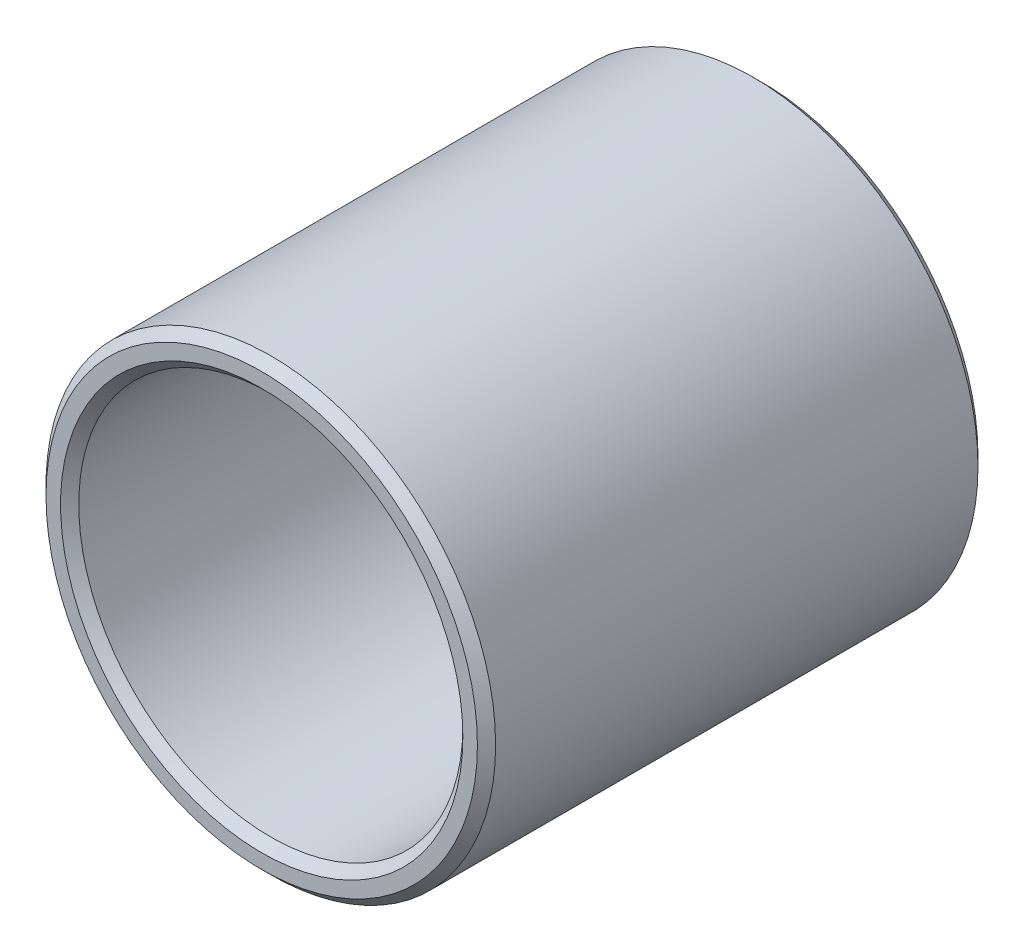
ISO-10303-21;
HEADER;
FILE_DESCRIPTION(('STEP AP214'),'2;1');
FILE_NAME('part.step','',(''),(''),'','','');
FILE_SCHEMA(('AUTOMOTIVE_DESIGN { 1 0 10303 214 1 1 1 1 }'));
ENDSEC;
DATA;
#1=APPLICATION_CONTEXT('core data for automotive mechanical design processes');
#2=APPLICATION_PROTOCOL_DEFINITION('international standard','automotive_design',2000,#1);
#3=PRODUCT_CONTEXT('',#1,'mechanical');
#4=PRODUCT('Part','Part','',(#3));
#5=PRODUCT_RELATED_PRODUCT_CATEGORY('part','',(#4));
#6=PRODUCT_DEFINITION_FORMATION('','',#4);
#7=PRODUCT_DEFINITION_CONTEXT('part definition',#1,'design');
#8=PRODUCT_DEFINITION('design','',#6,#7);
#9=PRODUCT_DEFINITION_SHAPE('','',#8);
#10=(LENGTH_UNIT() NAMED_UNIT(*) SI_UNIT(.MILLI.,.METRE.));
#11=(NAMED_UNIT(*) PLANE_ANGLE_UNIT() SI_UNIT($,.RADIAN.));
#12=(NAMED_UNIT(*) SI_UNIT($,.STERADIAN.) SOLID_ANGLE_UNIT());
#13=UNCERTAINTY_MEASURE_WITH_UNIT(LENGTH_MEASURE(1.E-05),#10,'distance_accuracy_value','');
#14=(GEOMETRIC_REPRESENTATION_CONTEXT(3) GLOBAL_UNCERTAINTY_ASSIGNED_CONTEXT((#13)) GLOBAL_UNIT_ASSIGNED_CONTEXT((#10,
#11,#12)) REPRESENTATION_CONTEXT('',''));
#15=CARTESIAN_POINT('',(0.,0.,0.));
#16=DIRECTION('',(0.,0.,1.));
#17=DIRECTION('',(1.,0.,0.));
#18=AXIS2_PLACEMENT_3D('',#15,#16,#17);
#19=CARTESIAN_POINT('',(0.,0.,13.75));
#20=DIRECTION('',(0.,0.,1.));
#21=DIRECTION('',(1.,0.,0.));
#22=AXIS2_PLACEMENT_3D('',#19,#20,#21);
#23=PLANE('',#22);
#24=CARTESIAN_POINT('',(0.,0.,13.75));
#25=DIRECTION('',(0.,0.,1.));
#26=DIRECTION('',(1.,0.,0.));
#27=AXIS2_PLACEMENT_3D('',#24,#25,#26);
#28=CIRCLE('',#27,11.85);
#29=CARTESIAN_POINT('',(11.85,0.,13.75));
#30=VERTEX_POINT('',#29);
#31=EDGE_CURVE('E45',#30,#30,#28,.T.);
#32=ORIENTED_EDGE('',*,*,#31,.T.);
#33=EDGE_LOOP('',(#32));
#34=FACE_BOUND('',#33,.T.);
#35=CARTESIAN_POINT('',(0.,0.,13.75));
#36=DIRECTION('',(0.,0.,1.));
#37=DIRECTION('',(1.,0.,0.));
#38=AXIS2_PLACEMENT_3D('',#35,#36,#37);
#39=CIRCLE('',#38,11.05);
#40=CARTESIAN_POINT('',(11.05,0.,13.75));
#41=VERTEX_POINT('',#40);
#42=EDGE_CURVE('E49',#41,#41,#39,.F.);
#43=ORIENTED_EDGE('',*,*,#42,.T.);
#44=EDGE_LOOP('',(#43));
#45=FACE_BOUND('',#44,.T.);
#46=ADVANCED_FACE('F34',(#34,#45),#23,.T.);
#47=CARTESIAN_POINT('',(0.,0.,-13.75));
#48=DIRECTION('',(0.,0.,1.));
#49=DIRECTION('',(1.,0.,0.));
#50=AXIS2_PLACEMENT_3D('',#47,#48,#49);
#51=PLANE('',#50);
#52=CARTESIAN_POINT('',(0.,0.,-13.75));
#53=DIRECTION('',(0.,0.,1.));
#54=DIRECTION('',(1.,0.,0.));
#55=AXIS2_PLACEMENT_3D('',#52,#53,#54);
#56=CIRCLE('',#55,11.85);
#57=CARTESIAN_POINT('',(11.85,0.,-13.75));
#58=VERTEX_POINT('',#57);
#59=EDGE_CURVE('E54',#58,#58,#56,.F.);
#60=ORIENTED_EDGE('',*,*,#59,.T.);
#61=EDGE_LOOP('',(#60));
#62=FACE_BOUND('',#61,.T.);
#63=CARTESIAN_POINT('',(0.,0.,-13.75));
#64=DIRECTION('',(0.,0.,1.));
#65=DIRECTION('',(1.,0.,0.));
#66=AXIS2_PLACEMENT_3D('',#63,#64,#65);
#67=CIRCLE('',#66,11.05);
#68=CARTESIAN_POINT('',(11.05,0.,-13.75));
#69=VERTEX_POINT('',#68);
#70=EDGE_CURVE('E57',#69,#69,#67,.T.);
#71=ORIENTED_EDGE('',*,*,#70,.T.);
#72=EDGE_LOOP('',(#71));
#73=FACE_BOUND('',#72,.T.);
#74=ADVANCED_FACE('F79',(#62,#73),#51,.F.);
#75=CARTESIAN_POINT('',(0.,0.,13.75));
#76=DIRECTION('',(0.,0.,-1.));
#77=DIRECTION('',(-1.,0.,0.));
#78=AXIS2_PLACEMENT_3D('',#75,#76,#77);
#79=CYLINDRICAL_SURFACE('',#78,12.35);
#80=CARTESIAN_POINT('',(0.,0.,-13.25));
#81=DIRECTION('',(0.,0.,1.));
#82=DIRECTION('',(1.,0.,0.));
#83=AXIS2_PLACEMENT_3D('',#80,#81,#82);
#84=CIRCLE('',#83,12.35);
#85=CARTESIAN_POINT('',(12.35,0.,-13.25));
#86=VERTEX_POINT('',#85);
#87=EDGE_CURVE('E60',#86,#86,#84,.T.);
#88=ORIENTED_EDGE('',*,*,#87,.T.);
#89=EDGE_LOOP('',(#88));
#90=FACE_BOUND('',#89,.T.);
#91=CARTESIAN_POINT('',(0.,0.,13.25));
#92=DIRECTION('',(0.,0.,1.));
#93=DIRECTION('',(1.,0.,0.));
#94=AXIS2_PLACEMENT_3D('',#91,#92,#93);
#95=CIRCLE('',#94,12.35);
#96=CARTESIAN_POINT('',(12.35,0.,13.25));
#97=VERTEX_POINT('',#96);
#98=EDGE_CURVE('E63',#97,#97,#95,.F.);
#99=ORIENTED_EDGE('',*,*,#98,.T.);
#100=EDGE_LOOP('',(#99));
#101=FACE_BOUND('',#100,.T.);
#102=ADVANCED_FACE('F67',(#90,#101),#79,.T.);
#103=CARTESIAN_POINT('',(0.,0.,13.75));
#104=DIRECTION('',(0.,0.,-1.));
#105=DIRECTION('',(-1.,0.,0.));
#106=AXIS2_PLACEMENT_3D('',#103,#104,#105);
#107=CYLINDRICAL_SURFACE('',#106,10.55);
#108=CARTESIAN_POINT('',(0.,0.,-13.25));
#109=DIRECTION('',(0.,0.,1.));
#110=DIRECTION('',(1.,0.,0.));
#111=AXIS2_PLACEMENT_3D('',#108,#109,#110);
#112=CIRCLE('',#111,10.55);
#113=CARTESIAN_POINT('',(10.55,0.,-13.25));
#114=VERTEX_POINT('',#113);
#115=EDGE_CURVE('E10',#114,#114,#112,.F.);
#116=ORIENTED_EDGE('',*,*,#115,.T.);
#117=EDGE_LOOP('',(#116));
#118=FACE_BOUND('',#117,.T.);
#119=CARTESIAN_POINT('',(0.,0.,13.25));
#120=DIRECTION('',(0.,0.,1.));
#121=DIRECTION('',(1.,0.,0.));
#122=AXIS2_PLACEMENT_3D('',#119,#120,#121);
#123=CIRCLE('',#122,10.55);
#124=CARTESIAN_POINT('',(10.55,0.,13.25));
#125=VERTEX_POINT('',#124);
#126=EDGE_CURVE('E41',#125,#125,#123,.T.);
#127=ORIENTED_EDGE('',*,*,#126,.T.);
#128=EDGE_LOOP('',(#127));
#129=FACE_BOUND('',#128,.T.);
#130=ADVANCED_FACE('F95',(#118,#129),#107,.F.);
#131=CARTESIAN_POINT('',(0.,0.,-13.25));
#132=DIRECTION('',(0.,0.,1.));
#133=DIRECTION('',(1.,0.,0.));
#134=AXIS2_PLACEMENT_3D('',#131,#132,#133);
#135=CONICAL_SURFACE('',#134,12.35,0.785398163397447);
#136=ORIENTED_EDGE('',*,*,#59,.F.);
#137=EDGE_LOOP('',(#136));
#138=FACE_BOUND('',#137,.T.);
#139=ORIENTED_EDGE('',*,*,#87,.F.);
#140=EDGE_LOOP('',(#139));
#141=FACE_BOUND('',#140,.T.);
#142=ADVANCED_FACE('F73',(#138,#141),#135,.T.);
#143=CARTESIAN_POINT('',(0.,0.,13.75));
#144=DIRECTION('',(0.,0.,-1.));
#145=DIRECTION('',(-1.,0.,0.));
#146=AXIS2_PLACEMENT_3D('',#143,#144,#145);
#147=CONICAL_SURFACE('',#146,11.85,0.785398163397447);
#148=ORIENTED_EDGE('',*,*,#98,.F.);
#149=EDGE_LOOP('',(#148));
#150=FACE_BOUND('',#149,.T.);
#151=ORIENTED_EDGE('',*,*,#31,.F.);
#152=EDGE_LOOP('',(#151));
#153=FACE_BOUND('',#152,.T.);
#154=ADVANCED_FACE('F69',(#150,#153),#147,.T.);
#155=CARTESIAN_POINT('',(0.,0.,-13.75));
#156=DIRECTION('',(0.,0.,-1.));
#157=DIRECTION('',(-1.,0.,0.));
#158=AXIS2_PLACEMENT_3D('',#155,#156,#157);
#159=CONICAL_SURFACE('',#158,11.05,0.785398163397448);
#160=ORIENTED_EDGE('',*,*,#115,.F.);
#161=EDGE_LOOP('',(#160));
#162=FACE_BOUND('',#161,.T.);
#163=ORIENTED_EDGE('',*,*,#70,.F.);
#164=EDGE_LOOP('',(#163));
#165=FACE_BOUND('',#164,.T.);
#166=ADVANCED_FACE('F72',(#162,#165),#159,.F.);
#167=CARTESIAN_POINT('',(0.,0.,13.25));
#168=DIRECTION('',(0.,0.,1.));
#169=DIRECTION('',(1.,0.,0.));
#170=AXIS2_PLACEMENT_3D('',#167,#168,#169);
#171=CONICAL_SURFACE('',#170,10.55,0.785398163397447);
#172=ORIENTED_EDGE('',*,*,#42,.F.);
#173=EDGE_LOOP('',(#172));
#174=FACE_BOUND('',#173,.T.);
#175=ORIENTED_EDGE('',*,*,#126,.F.);
#176=EDGE_LOOP('',(#175));
#177=FACE_BOUND('',#176,.T.);
#178=ADVANCED_FACE('F36',(#174,#177),#171,.F.);
#179=CLOSED_SHELL('',(#46,#74,#102,#130,#142,#154,#166,#178));
#180=MANIFOLD_SOLID_BREP('B2',#179);
#181=ADVANCED_BREP_SHAPE_REPRESENTATION('',(#18,#180),#14);
#182=SHAPE_DEFINITION_REPRESENTATION(#9,#181);
ENDSEC;
END-ISO-10303-21;
